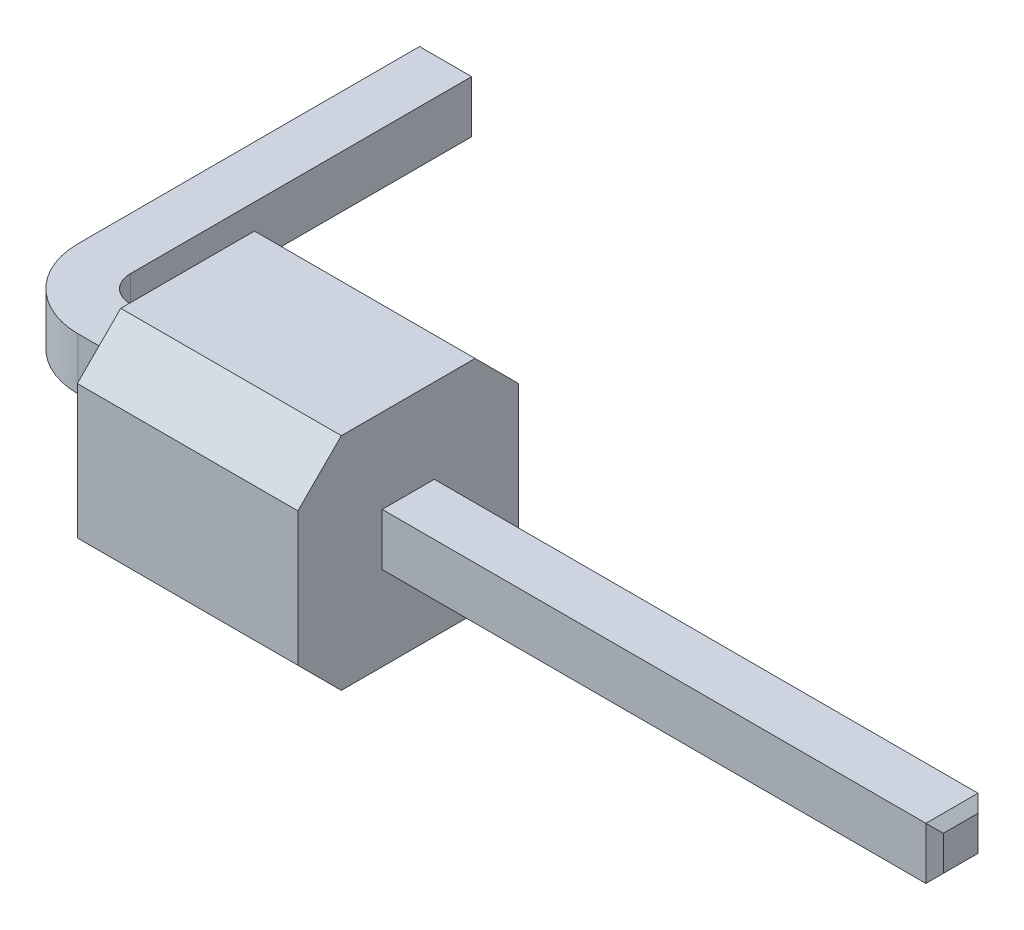
ISO-10303-21;
HEADER;
FILE_DESCRIPTION(('STEP AP214'),'2;1');
FILE_NAME('part.step','',(''),(''),'','','');
FILE_SCHEMA(('AUTOMOTIVE_DESIGN { 1 0 10303 214 1 1 1 1 }'));
ENDSEC;
DATA;
#1=APPLICATION_CONTEXT('core data for automotive mechanical design processes');
#2=APPLICATION_PROTOCOL_DEFINITION('international standard','automotive_design',2000,#1);
#3=PRODUCT_CONTEXT('',#1,'mechanical');
#4=PRODUCT('Part','Part','',(#3));
#5=PRODUCT_RELATED_PRODUCT_CATEGORY('part','',(#4));
#6=PRODUCT_DEFINITION_FORMATION('','',#4);
#7=PRODUCT_DEFINITION_CONTEXT('part definition',#1,'design');
#8=PRODUCT_DEFINITION('design','',#6,#7);
#9=PRODUCT_DEFINITION_SHAPE('','',#8);
#10=(LENGTH_UNIT() NAMED_UNIT(*) SI_UNIT(.MILLI.,.METRE.));
#11=(NAMED_UNIT(*) PLANE_ANGLE_UNIT() SI_UNIT($,.RADIAN.));
#12=(NAMED_UNIT(*) SI_UNIT($,.STERADIAN.) SOLID_ANGLE_UNIT());
#13=UNCERTAINTY_MEASURE_WITH_UNIT(LENGTH_MEASURE(1.E-05),#10,'distance_accuracy_value','');
#14=(GEOMETRIC_REPRESENTATION_CONTEXT(3) GLOBAL_UNCERTAINTY_ASSIGNED_CONTEXT((#13)) GLOBAL_UNIT_ASSIGNED_CONTEXT((#10,
#11,#12)) REPRESENTATION_CONTEXT('',''));
#15=CARTESIAN_POINT('',(0.,0.,0.));
#16=DIRECTION('',(0.,0.,1.));
#17=DIRECTION('',(1.,0.,0.));
#18=AXIS2_PLACEMENT_3D('',#15,#16,#17);
#19=CARTESIAN_POINT('',(2.54,1.27,2.04));
#20=DIRECTION('',(0.,-0.707106781186549,-0.707106781186546));
#21=DIRECTION('',(0.,0.707106781186546,-0.707106781186549));
#22=AXIS2_PLACEMENT_3D('',#19,#20,#21);
#23=PLANE('',#22);
#24=DIRECTION('',(0.,-0.707106781186546,0.707106781186549));
#25=VECTOR('',#24,1.);
#26=CARTESIAN_POINT('',(0.,1.27,2.04));
#27=LINE('',#26,#25);
#28=CARTESIAN_POINT('',(0.,1.27,2.04));
#29=VERTEX_POINT('',#28);
#30=CARTESIAN_POINT('',(0.,0.77,2.54));
#31=VERTEX_POINT('',#30);
#32=EDGE_CURVE('E263',#29,#31,#27,.T.);
#33=ORIENTED_EDGE('',*,*,#32,.T.);
#34=DIRECTION('',(-1.,0.,0.));
#35=VECTOR('',#34,1.);
#36=CARTESIAN_POINT('',(2.54,0.77,2.54));
#37=LINE('',#36,#35);
#38=CARTESIAN_POINT('',(2.54,0.77,2.54));
#39=VERTEX_POINT('',#38);
#40=EDGE_CURVE('E318',#39,#31,#37,.T.);
#41=ORIENTED_EDGE('',*,*,#40,.F.);
#42=DIRECTION('',(0.,-0.707106781186546,0.707106781186549));
#43=VECTOR('',#42,1.);
#44=CARTESIAN_POINT('',(2.54,1.27,2.04));
#45=LINE('',#44,#43);
#46=CARTESIAN_POINT('',(2.54,1.27,2.04));
#47=VERTEX_POINT('',#46);
#48=EDGE_CURVE('E264',#47,#39,#45,.T.);
#49=ORIENTED_EDGE('',*,*,#48,.F.);
#50=DIRECTION('',(-1.,0.,0.));
#51=VECTOR('',#50,1.);
#52=CARTESIAN_POINT('',(2.54,1.27,2.04));
#53=LINE('',#52,#51);
#54=EDGE_CURVE('E282',#47,#29,#53,.T.);
#55=ORIENTED_EDGE('',*,*,#54,.T.);
#56=EDGE_LOOP('',(#33,#41,#49,#55));
#57=FACE_BOUND('',#56,.T.);
#58=ADVANCED_FACE('F33',(#57),#23,.F.);
#59=CARTESIAN_POINT('',(2.54,0.77,2.54));
#60=DIRECTION('',(0.,0.,-1.));
#61=DIRECTION('',(-1.,0.,0.));
#62=AXIS2_PLACEMENT_3D('',#59,#60,#61);
#63=PLANE('',#62);
#64=DIRECTION('',(0.,-1.,0.));
#65=VECTOR('',#64,1.);
#66=CARTESIAN_POINT('',(0.,0.77,2.54));
#67=LINE('',#66,#65);
#68=CARTESIAN_POINT('',(0.,-0.77,2.54));
#69=VERTEX_POINT('',#68);
#70=EDGE_CURVE('E285',#31,#69,#67,.T.);
#71=ORIENTED_EDGE('',*,*,#70,.T.);
#72=DIRECTION('',(-1.,0.,0.));
#73=VECTOR('',#72,1.);
#74=CARTESIAN_POINT('',(2.54,-0.77,2.54));
#75=LINE('',#74,#73);
#76=CARTESIAN_POINT('',(2.54,-0.77,2.54));
#77=VERTEX_POINT('',#76);
#78=EDGE_CURVE('E315',#77,#69,#75,.T.);
#79=ORIENTED_EDGE('',*,*,#78,.F.);
#80=DIRECTION('',(0.,-1.,0.));
#81=VECTOR('',#80,1.);
#82=CARTESIAN_POINT('',(2.54,0.77,2.54));
#83=LINE('',#82,#81);
#84=EDGE_CURVE('E267',#39,#77,#83,.T.);
#85=ORIENTED_EDGE('',*,*,#84,.F.);
#86=ORIENTED_EDGE('',*,*,#40,.T.);
#87=EDGE_LOOP('',(#71,#79,#85,#86));
#88=FACE_BOUND('',#87,.T.);
#89=ADVANCED_FACE('F404',(#88),#63,.F.);
#90=CARTESIAN_POINT('',(2.54,-1.27,2.04));
#91=DIRECTION('',(0.,0.707106781186549,-0.707106781186546));
#92=DIRECTION('',(0.,0.707106781186546,0.707106781186549));
#93=AXIS2_PLACEMENT_3D('',#90,#91,#92);
#94=PLANE('',#93);
#95=DIRECTION('',(0.,-0.707106781186546,-0.707106781186549));
#96=VECTOR('',#95,1.);
#97=CARTESIAN_POINT('',(0.,-1.27,2.04));
#98=LINE('',#97,#96);
#99=CARTESIAN_POINT('',(0.,-1.27,2.04));
#100=VERTEX_POINT('',#99);
#101=EDGE_CURVE('E287',#69,#100,#98,.T.);
#102=ORIENTED_EDGE('',*,*,#101,.T.);
#103=DIRECTION('',(-1.,0.,0.));
#104=VECTOR('',#103,1.);
#105=CARTESIAN_POINT('',(2.54,-1.27,2.04));
#106=LINE('',#105,#104);
#107=CARTESIAN_POINT('',(2.54,-1.27,2.04));
#108=VERTEX_POINT('',#107);
#109=EDGE_CURVE('E312',#108,#100,#106,.T.);
#110=ORIENTED_EDGE('',*,*,#109,.F.);
#111=DIRECTION('',(0.,-0.707106781186546,-0.707106781186549));
#112=VECTOR('',#111,1.);
#113=CARTESIAN_POINT('',(2.54,-1.27,2.04));
#114=LINE('',#113,#112);
#115=EDGE_CURVE('E270',#77,#108,#114,.T.);
#116=ORIENTED_EDGE('',*,*,#115,.F.);
#117=ORIENTED_EDGE('',*,*,#78,.T.);
#118=EDGE_LOOP('',(#102,#110,#116,#117));
#119=FACE_BOUND('',#118,.T.);
#120=ADVANCED_FACE('F410',(#119),#94,.F.);
#121=CARTESIAN_POINT('',(2.54,-1.27,2.04));
#122=DIRECTION('',(0.,1.,0.));
#123=DIRECTION('',(0.,0.,1.));
#124=AXIS2_PLACEMENT_3D('',#121,#122,#123);
#125=PLANE('',#124);
#126=DIRECTION('',(0.,0.,-1.));
#127=VECTOR('',#126,1.);
#128=CARTESIAN_POINT('',(0.,-1.27,2.04));
#129=LINE('',#128,#127);
#130=CARTESIAN_POINT('',(0.,-1.27,0.500000000000002));
#131=VERTEX_POINT('',#130);
#132=EDGE_CURVE('E289',#100,#131,#129,.T.);
#133=ORIENTED_EDGE('',*,*,#132,.T.);
#134=DIRECTION('',(-1.,0.,0.));
#135=VECTOR('',#134,1.);
#136=CARTESIAN_POINT('',(2.54,-1.27,0.500000000000002));
#137=LINE('',#136,#135);
#138=CARTESIAN_POINT('',(2.54,-1.27,0.500000000000002));
#139=VERTEX_POINT('',#138);
#140=EDGE_CURVE('E309',#139,#131,#137,.T.);
#141=ORIENTED_EDGE('',*,*,#140,.F.);
#142=DIRECTION('',(0.,0.,-1.));
#143=VECTOR('',#142,1.);
#144=CARTESIAN_POINT('',(2.54,-1.27,2.04));
#145=LINE('',#144,#143);
#146=EDGE_CURVE('E272',#108,#139,#145,.T.);
#147=ORIENTED_EDGE('',*,*,#146,.F.);
#148=ORIENTED_EDGE('',*,*,#109,.T.);
#149=EDGE_LOOP('',(#133,#141,#147,#148));
#150=FACE_BOUND('',#149,.T.);
#151=ADVANCED_FACE('F533',(#150),#125,.F.);
#152=CARTESIAN_POINT('',(2.54,-1.27,0.500000000000002));
#153=DIRECTION('',(0.,0.707106781186549,0.707106781186546));
#154=DIRECTION('',(0.,-0.707106781186546,0.707106781186549));
#155=AXIS2_PLACEMENT_3D('',#152,#153,#154);
#156=PLANE('',#155);
#157=DIRECTION('',(0.,0.707106781186546,-0.707106781186549));
#158=VECTOR('',#157,1.);
#159=CARTESIAN_POINT('',(0.,-1.27,0.500000000000002));
#160=LINE('',#159,#158);
#161=CARTESIAN_POINT('',(0.,-0.77,0.));
#162=VERTEX_POINT('',#161);
#163=EDGE_CURVE('E291',#131,#162,#160,.T.);
#164=ORIENTED_EDGE('',*,*,#163,.T.);
#165=DIRECTION('',(-1.,0.,0.));
#166=VECTOR('',#165,1.);
#167=CARTESIAN_POINT('',(2.54,-0.77,0.));
#168=LINE('',#167,#166);
#169=CARTESIAN_POINT('',(2.54,-0.77,0.));
#170=VERTEX_POINT('',#169);
#171=EDGE_CURVE('E306',#170,#162,#168,.T.);
#172=ORIENTED_EDGE('',*,*,#171,.F.);
#173=DIRECTION('',(0.,0.707106781186546,-0.707106781186549));
#174=VECTOR('',#173,1.);
#175=CARTESIAN_POINT('',(2.54,-1.27,0.500000000000002));
#176=LINE('',#175,#174);
#177=EDGE_CURVE('E274',#139,#170,#176,.T.);
#178=ORIENTED_EDGE('',*,*,#177,.F.);
#179=ORIENTED_EDGE('',*,*,#140,.T.);
#180=EDGE_LOOP('',(#164,#172,#178,#179));
#181=FACE_BOUND('',#180,.T.);
#182=ADVANCED_FACE('F529',(#181),#156,.F.);
#183=CARTESIAN_POINT('',(2.54,0.77,0.));
#184=DIRECTION('',(0.,0.,1.));
#185=DIRECTION('',(1.,0.,0.));
#186=AXIS2_PLACEMENT_3D('',#183,#184,#185);
#187=PLANE('',#186);
#188=DIRECTION('',(0.,1.,0.));
#189=VECTOR('',#188,1.);
#190=CARTESIAN_POINT('',(0.,0.77,0.));
#191=LINE('',#190,#189);
#192=CARTESIAN_POINT('',(0.,0.77,0.));
#193=VERTEX_POINT('',#192);
#194=EDGE_CURVE('E293',#162,#193,#191,.T.);
#195=ORIENTED_EDGE('',*,*,#194,.T.);
#196=DIRECTION('',(-1.,0.,0.));
#197=VECTOR('',#196,1.);
#198=CARTESIAN_POINT('',(2.54,0.77,0.));
#199=LINE('',#198,#197);
#200=CARTESIAN_POINT('',(2.54,0.77,0.));
#201=VERTEX_POINT('',#200);
#202=EDGE_CURVE('E303',#201,#193,#199,.T.);
#203=ORIENTED_EDGE('',*,*,#202,.F.);
#204=DIRECTION('',(0.,1.,0.));
#205=VECTOR('',#204,1.);
#206=CARTESIAN_POINT('',(2.54,0.77,0.));
#207=LINE('',#206,#205);
#208=EDGE_CURVE('E276',#170,#201,#207,.T.);
#209=ORIENTED_EDGE('',*,*,#208,.F.);
#210=ORIENTED_EDGE('',*,*,#171,.T.);
#211=EDGE_LOOP('',(#195,#203,#209,#210));
#212=FACE_BOUND('',#211,.T.);
#213=ADVANCED_FACE('F525',(#212),#187,.F.);
#214=CARTESIAN_POINT('',(2.54,1.27,0.500000000000002));
#215=DIRECTION('',(0.,-0.707106781186549,0.707106781186546));
#216=DIRECTION('',(0.,-0.707106781186546,-0.707106781186549));
#217=AXIS2_PLACEMENT_3D('',#214,#215,#216);
#218=PLANE('',#217);
#219=DIRECTION('',(0.,0.707106781186546,0.707106781186549));
#220=VECTOR('',#219,1.);
#221=CARTESIAN_POINT('',(0.,1.27,0.500000000000002));
#222=LINE('',#221,#220);
#223=CARTESIAN_POINT('',(0.,1.27,0.500000000000002));
#224=VERTEX_POINT('',#223);
#225=EDGE_CURVE('E295',#193,#224,#222,.T.);
#226=ORIENTED_EDGE('',*,*,#225,.T.);
#227=DIRECTION('',(-1.,0.,0.));
#228=VECTOR('',#227,1.);
#229=CARTESIAN_POINT('',(2.54,1.27,0.500000000000002));
#230=LINE('',#229,#228);
#231=CARTESIAN_POINT('',(2.54,1.27,0.500000000000002));
#232=VERTEX_POINT('',#231);
#233=EDGE_CURVE('E300',#232,#224,#230,.T.);
#234=ORIENTED_EDGE('',*,*,#233,.F.);
#235=DIRECTION('',(0.,0.707106781186546,0.707106781186549));
#236=VECTOR('',#235,1.);
#237=CARTESIAN_POINT('',(2.54,1.27,0.500000000000002));
#238=LINE('',#237,#236);
#239=EDGE_CURVE('E278',#201,#232,#238,.T.);
#240=ORIENTED_EDGE('',*,*,#239,.F.);
#241=ORIENTED_EDGE('',*,*,#202,.T.);
#242=EDGE_LOOP('',(#226,#234,#240,#241));
#243=FACE_BOUND('',#242,.T.);
#244=ADVANCED_FACE('F521',(#243),#218,.F.);
#245=CARTESIAN_POINT('',(2.54,1.27,2.04));
#246=DIRECTION('',(0.,-1.,0.));
#247=DIRECTION('',(0.,0.,-1.));
#248=AXIS2_PLACEMENT_3D('',#245,#246,#247);
#249=PLANE('',#248);
#250=DIRECTION('',(0.,0.,1.));
#251=VECTOR('',#250,1.);
#252=CARTESIAN_POINT('',(0.,1.27,2.04));
#253=LINE('',#252,#251);
#254=EDGE_CURVE('E268',#224,#29,#253,.T.);
#255=ORIENTED_EDGE('',*,*,#254,.T.);
#256=ORIENTED_EDGE('',*,*,#54,.F.);
#257=DIRECTION('',(0.,0.,1.));
#258=VECTOR('',#257,1.);
#259=CARTESIAN_POINT('',(2.54,1.27,2.04));
#260=LINE('',#259,#258);
#261=EDGE_CURVE('E280',#232,#47,#260,.T.);
#262=ORIENTED_EDGE('',*,*,#261,.F.);
#263=ORIENTED_EDGE('',*,*,#233,.T.);
#264=EDGE_LOOP('',(#255,#256,#262,#263));
#265=FACE_BOUND('',#264,.T.);
#266=ADVANCED_FACE('F516',(#265),#249,.F.);
#267=CARTESIAN_POINT('',(2.54,0.,0.));
#268=DIRECTION('',(-1.,0.,0.));
#269=DIRECTION('',(0.,0.,1.));
#270=AXIS2_PLACEMENT_3D('',#267,#268,#269);
#271=PLANE('',#270);
#272=DIRECTION('',(0.,-1.,0.));
#273=VECTOR('',#272,1.);
#274=CARTESIAN_POINT('',(2.54,0.,1.57));
#275=LINE('',#274,#273);
#276=CARTESIAN_POINT('',(2.54,0.3,1.57));
#277=VERTEX_POINT('',#276);
#278=CARTESIAN_POINT('',(2.54,-0.3,1.57));
#279=VERTEX_POINT('',#278);
#280=EDGE_CURVE('E260',#277,#279,#275,.T.);
#281=ORIENTED_EDGE('',*,*,#280,.F.);
#282=DIRECTION('',(0.,0.,-1.));
#283=VECTOR('',#282,1.);
#284=CARTESIAN_POINT('',(2.54,0.3,0.));
#285=LINE('',#284,#283);
#286=CARTESIAN_POINT('',(2.54,0.3,0.97));
#287=VERTEX_POINT('',#286);
#288=EDGE_CURVE('E254',#277,#287,#285,.T.);
#289=ORIENTED_EDGE('',*,*,#288,.T.);
#290=DIRECTION('',(0.,1.,0.));
#291=VECTOR('',#290,1.);
#292=CARTESIAN_POINT('',(2.54,0.,0.97));
#293=LINE('',#292,#291);
#294=CARTESIAN_POINT('',(2.54,-0.3,0.97));
#295=VERTEX_POINT('',#294);
#296=EDGE_CURVE('E257',#295,#287,#293,.T.);
#297=ORIENTED_EDGE('',*,*,#296,.F.);
#298=DIRECTION('',(0.,0.,-1.));
#299=VECTOR('',#298,1.);
#300=CARTESIAN_POINT('',(2.54,-0.3,0.));
#301=LINE('',#300,#299);
#302=EDGE_CURVE('E212',#279,#295,#301,.T.);
#303=ORIENTED_EDGE('',*,*,#302,.F.);
#304=EDGE_LOOP('',(#281,#289,#297,#303));
#305=FACE_BOUND('',#304,.T.);
#306=ORIENTED_EDGE('',*,*,#48,.T.);
#307=ORIENTED_EDGE('',*,*,#84,.T.);
#308=ORIENTED_EDGE('',*,*,#115,.T.);
#309=ORIENTED_EDGE('',*,*,#146,.T.);
#310=ORIENTED_EDGE('',*,*,#177,.T.);
#311=ORIENTED_EDGE('',*,*,#208,.T.);
#312=ORIENTED_EDGE('',*,*,#239,.T.);
#313=ORIENTED_EDGE('',*,*,#261,.T.);
#314=EDGE_LOOP('',(#306,#307,#308,#309,#310,#311,#312,#313));
#315=FACE_BOUND('',#314,.T.);
#316=ADVANCED_FACE('F460',(#305,#315),#271,.F.);
#317=CARTESIAN_POINT('',(0.,0.,0.));
#318=DIRECTION('',(-1.,0.,0.));
#319=DIRECTION('',(0.,0.,1.));
#320=AXIS2_PLACEMENT_3D('',#317,#318,#319);
#321=PLANE('',#320);
#322=DIRECTION('',(0.,0.,-1.));
#323=VECTOR('',#322,1.);
#324=CARTESIAN_POINT('',(0.,0.3,0.));
#325=LINE('',#324,#323);
#326=CARTESIAN_POINT('',(0.,0.3,1.57));
#327=VERTEX_POINT('',#326);
#328=CARTESIAN_POINT('',(0.,0.3,0.97));
#329=VERTEX_POINT('',#328);
#330=EDGE_CURVE('E330',#327,#329,#325,.T.);
#331=ORIENTED_EDGE('',*,*,#330,.F.);
#332=DIRECTION('',(0.,-1.,0.));
#333=VECTOR('',#332,1.);
#334=CARTESIAN_POINT('',(0.,0.,1.57));
#335=LINE('',#334,#333);
#336=CARTESIAN_POINT('',(0.,-0.3,1.57));
#337=VERTEX_POINT('',#336);
#338=EDGE_CURVE('E327',#327,#337,#335,.T.);
#339=ORIENTED_EDGE('',*,*,#338,.T.);
#340=DIRECTION('',(0.,0.,-1.));
#341=VECTOR('',#340,1.);
#342=CARTESIAN_POINT('',(0.,-0.3,0.));
#343=LINE('',#342,#341);
#344=CARTESIAN_POINT('',(0.,-0.3,0.97));
#345=VERTEX_POINT('',#344);
#346=EDGE_CURVE('E321',#337,#345,#343,.T.);
#347=ORIENTED_EDGE('',*,*,#346,.T.);
#348=DIRECTION('',(0.,1.,0.));
#349=VECTOR('',#348,1.);
#350=CARTESIAN_POINT('',(0.,0.,0.97));
#351=LINE('',#350,#349);
#352=EDGE_CURVE('E324',#345,#329,#351,.T.);
#353=ORIENTED_EDGE('',*,*,#352,.T.);
#354=EDGE_LOOP('',(#331,#339,#347,#353));
#355=FACE_BOUND('',#354,.T.);
#356=ORIENTED_EDGE('',*,*,#32,.F.);
#357=ORIENTED_EDGE('',*,*,#254,.F.);
#358=ORIENTED_EDGE('',*,*,#225,.F.);
#359=ORIENTED_EDGE('',*,*,#194,.F.);
#360=ORIENTED_EDGE('',*,*,#163,.F.);
#361=ORIENTED_EDGE('',*,*,#132,.F.);
#362=ORIENTED_EDGE('',*,*,#101,.F.);
#363=ORIENTED_EDGE('',*,*,#70,.F.);
#364=EDGE_LOOP('',(#356,#357,#358,#359,#360,#361,#362,#363));
#365=FACE_BOUND('',#364,.T.);
#366=ADVANCED_FACE('F488',(#355,#365),#321,.T.);
#367=CARTESIAN_POINT('',(-0.96,0.3,0.67));
#368=DIRECTION('',(0.,-1.,0.));
#369=DIRECTION('',(0.,0.,-1.));
#370=AXIS2_PLACEMENT_3D('',#367,#368,#369);
#371=CYLINDRICAL_SURFACE('',#370,0.3);
#372=CARTESIAN_POINT('',(-0.96,-0.3,0.67));
#373=DIRECTION('',(0.,-1.,0.));
#374=DIRECTION('',(0.,0.,1.));
#375=AXIS2_PLACEMENT_3D('',#372,#373,#374);
#376=CIRCLE('',#375,0.3);
#377=CARTESIAN_POINT('',(-0.96,-0.3,0.97));
#378=VERTEX_POINT('',#377);
#379=CARTESIAN_POINT('',(-1.26,-0.3,0.67));
#380=VERTEX_POINT('',#379);
#381=EDGE_CURVE('E243',#378,#380,#376,.T.);
#382=ORIENTED_EDGE('',*,*,#381,.T.);
#383=DIRECTION('',(0.,-1.,0.));
#384=VECTOR('',#383,1.);
#385=CARTESIAN_POINT('',(-1.26,0.3,0.67));
#386=LINE('',#385,#384);
#387=CARTESIAN_POINT('',(-1.26,0.3,0.67));
#388=VERTEX_POINT('',#387);
#389=EDGE_CURVE('E231',#388,#380,#386,.T.);
#390=ORIENTED_EDGE('',*,*,#389,.F.);
#391=CARTESIAN_POINT('',(-0.96,0.3,0.67));
#392=DIRECTION('',(0.,-1.,0.));
#393=DIRECTION('',(0.,0.,1.));
#394=AXIS2_PLACEMENT_3D('',#391,#392,#393);
#395=CIRCLE('',#394,0.3);
#396=CARTESIAN_POINT('',(-0.96,0.3,0.97));
#397=VERTEX_POINT('',#396);
#398=EDGE_CURVE('E227',#397,#388,#395,.T.);
#399=ORIENTED_EDGE('',*,*,#398,.F.);
#400=DIRECTION('',(0.,-1.,0.));
#401=VECTOR('',#400,1.);
#402=CARTESIAN_POINT('',(-0.96,0.3,0.97));
#403=LINE('',#402,#401);
#404=EDGE_CURVE('E248',#397,#378,#403,.T.);
#405=ORIENTED_EDGE('',*,*,#404,.T.);
#406=EDGE_LOOP('',(#382,#390,#399,#405));
#407=FACE_BOUND('',#406,.T.);
#408=ADVANCED_FACE('F496',(#407),#371,.F.);
#409=CARTESIAN_POINT('',(-1.26,0.3,-3.36));
#410=DIRECTION('',(-1.,0.,0.));
#411=DIRECTION('',(0.,0.,1.));
#412=AXIS2_PLACEMENT_3D('',#409,#410,#411);
#413=PLANE('',#412);
#414=DIRECTION('',(0.,0.,-1.));
#415=VECTOR('',#414,1.);
#416=CARTESIAN_POINT('',(-1.26,-0.3,-3.36));
#417=LINE('',#416,#415);
#418=CARTESIAN_POINT('',(-1.26,-0.3,-3.26));
#419=VERTEX_POINT('',#418);
#420=EDGE_CURVE('E204',#380,#419,#417,.T.);
#421=ORIENTED_EDGE('',*,*,#420,.T.);
#422=DIRECTION('',(0.,1.,0.));
#423=VECTOR('',#422,1.);
#424=CARTESIAN_POINT('',(-1.26,0.3,-3.26));
#425=LINE('',#424,#423);
#426=CARTESIAN_POINT('',(-1.26,0.3,-3.26));
#427=VERTEX_POINT('',#426);
#428=EDGE_CURVE('E360',#419,#427,#425,.T.);
#429=ORIENTED_EDGE('',*,*,#428,.T.);
#430=DIRECTION('',(0.,0.,-1.));
#431=VECTOR('',#430,1.);
#432=CARTESIAN_POINT('',(-1.26,0.3,-3.36));
#433=LINE('',#432,#431);
#434=EDGE_CURVE('E229',#388,#427,#433,.T.);
#435=ORIENTED_EDGE('',*,*,#434,.F.);
#436=ORIENTED_EDGE('',*,*,#389,.T.);
#437=EDGE_LOOP('',(#421,#429,#435,#436));
#438=FACE_BOUND('',#437,.T.);
#439=ADVANCED_FACE('F499',(#438),#413,.F.);
#440=CARTESIAN_POINT('',(-1.86,0.3,-3.36));
#441=DIRECTION('',(0.,0.,1.));
#442=DIRECTION('',(1.,0.,0.));
#443=AXIS2_PLACEMENT_3D('',#440,#441,#442);
#444=PLANE('',#443);
#445=DIRECTION('',(0.,1.,0.));
#446=VECTOR('',#445,1.);
#447=CARTESIAN_POINT('',(-1.76,0.3,-3.36));
#448=LINE('',#447,#446);
#449=CARTESIAN_POINT('',(-1.76,-0.200000000000001,-3.36));
#450=VERTEX_POINT('',#449);
#451=CARTESIAN_POINT('',(-1.76,0.200000000000001,-3.36));
#452=VERTEX_POINT('',#451);
#453=EDGE_CURVE('E353',#450,#452,#448,.T.);
#454=ORIENTED_EDGE('',*,*,#453,.T.);
#455=DIRECTION('',(1.,0.,0.));
#456=VECTOR('',#455,1.);
#457=CARTESIAN_POINT('',(-1.26,0.200000000000001,-3.36));
#458=LINE('',#457,#456);
#459=CARTESIAN_POINT('',(-1.36,0.200000000000001,-3.36));
#460=VERTEX_POINT('',#459);
#461=EDGE_CURVE('E357',#452,#460,#458,.T.);
#462=ORIENTED_EDGE('',*,*,#461,.T.);
#463=DIRECTION('',(0.,-1.,0.));
#464=VECTOR('',#463,1.);
#465=CARTESIAN_POINT('',(-1.36,0.3,-3.36));
#466=LINE('',#465,#464);
#467=CARTESIAN_POINT('',(-1.36,-0.200000000000001,-3.36));
#468=VERTEX_POINT('',#467);
#469=EDGE_CURVE('E355',#460,#468,#466,.T.);
#470=ORIENTED_EDGE('',*,*,#469,.T.);
#471=DIRECTION('',(-1.,0.,0.));
#472=VECTOR('',#471,1.);
#473=CARTESIAN_POINT('',(-1.86,-0.200000000000001,-3.36));
#474=LINE('',#473,#472);
#475=EDGE_CURVE('E351',#468,#450,#474,.T.);
#476=ORIENTED_EDGE('',*,*,#475,.T.);
#477=EDGE_LOOP('',(#454,#462,#470,#476));
#478=FACE_BOUND('',#477,.T.);
#479=ADVANCED_FACE('F390',(#478),#444,.F.);
#480=CARTESIAN_POINT('',(-1.86,0.3,-3.36));
#481=DIRECTION('',(1.,0.,0.));
#482=DIRECTION('',(0.,0.,-1.));
#483=AXIS2_PLACEMENT_3D('',#480,#481,#482);
#484=PLANE('',#483);
#485=DIRECTION('',(0.,0.,1.));
#486=VECTOR('',#485,1.);
#487=CARTESIAN_POINT('',(-1.86,0.3,-3.36));
#488=LINE('',#487,#486);
#489=CARTESIAN_POINT('',(-1.86,0.3,-3.26));
#490=VERTEX_POINT('',#489);
#491=CARTESIAN_POINT('',(-1.86,0.3,0.67));
#492=VERTEX_POINT('',#491);
#493=EDGE_CURVE('E194',#490,#492,#488,.T.);
#494=ORIENTED_EDGE('',*,*,#493,.F.);
#495=DIRECTION('',(0.,-1.,0.));
#496=VECTOR('',#495,1.);
#497=CARTESIAN_POINT('',(-1.86,0.3,-3.26));
#498=LINE('',#497,#496);
#499=CARTESIAN_POINT('',(-1.86,-0.3,-3.26));
#500=VERTEX_POINT('',#499);
#501=EDGE_CURVE('E42',#490,#500,#498,.T.);
#502=ORIENTED_EDGE('',*,*,#501,.T.);
#503=DIRECTION('',(0.,0.,1.));
#504=VECTOR('',#503,1.);
#505=CARTESIAN_POINT('',(-1.86,-0.3,-3.36));
#506=LINE('',#505,#504);
#507=CARTESIAN_POINT('',(-1.86,-0.3,0.67));
#508=VERTEX_POINT('',#507);
#509=EDGE_CURVE('E209',#500,#508,#506,.T.);
#510=ORIENTED_EDGE('',*,*,#509,.T.);
#511=DIRECTION('',(0.,-1.,0.));
#512=VECTOR('',#511,1.);
#513=CARTESIAN_POINT('',(-1.86,0.3,0.67));
#514=LINE('',#513,#512);
#515=EDGE_CURVE('E207',#492,#508,#514,.T.);
#516=ORIENTED_EDGE('',*,*,#515,.F.);
#517=EDGE_LOOP('',(#494,#502,#510,#516));
#518=FACE_BOUND('',#517,.T.);
#519=ADVANCED_FACE('F208',(#518),#484,.F.);
#520=CARTESIAN_POINT('',(-0.96,0.3,0.67));
#521=DIRECTION('',(0.,-1.,0.));
#522=DIRECTION('',(0.,0.,-1.));
#523=AXIS2_PLACEMENT_3D('',#520,#521,#522);
#524=CYLINDRICAL_SURFACE('',#523,0.9);
#525=CARTESIAN_POINT('',(-0.96,-0.3,0.67));
#526=DIRECTION('',(0.,1.,0.));
#527=DIRECTION('',(0.,0.,1.));
#528=AXIS2_PLACEMENT_3D('',#525,#526,#527);
#529=CIRCLE('',#528,0.9);
#530=CARTESIAN_POINT('',(-0.96,-0.3,1.57));
#531=VERTEX_POINT('',#530);
#532=EDGE_CURVE('E233',#508,#531,#529,.T.);
#533=ORIENTED_EDGE('',*,*,#532,.T.);
#534=DIRECTION('',(0.,-1.,0.));
#535=VECTOR('',#534,1.);
#536=CARTESIAN_POINT('',(-0.96,0.3,1.57));
#537=LINE('',#536,#535);
#538=CARTESIAN_POINT('',(-0.96,0.3,1.57));
#539=VERTEX_POINT('',#538);
#540=EDGE_CURVE('E213',#539,#531,#537,.T.);
#541=ORIENTED_EDGE('',*,*,#540,.F.);
#542=CARTESIAN_POINT('',(-0.96,0.3,0.67));
#543=DIRECTION('',(0.,1.,0.));
#544=DIRECTION('',(0.,0.,1.));
#545=AXIS2_PLACEMENT_3D('',#542,#543,#544);
#546=CIRCLE('',#545,0.9);
#547=EDGE_CURVE('E200',#492,#539,#546,.T.);
#548=ORIENTED_EDGE('',*,*,#547,.F.);
#549=ORIENTED_EDGE('',*,*,#515,.T.);
#550=EDGE_LOOP('',(#533,#541,#548,#549));
#551=FACE_BOUND('',#550,.T.);
#552=ADVANCED_FACE('F215',(#551),#524,.T.);
#553=CARTESIAN_POINT('',(-0.96,0.3,0.67));
#554=DIRECTION('',(0.,1.,0.));
#555=DIRECTION('',(0.,0.,1.));
#556=AXIS2_PLACEMENT_3D('',#553,#554,#555);
#557=PLANE('',#556);
#558=ORIENTED_EDGE('',*,*,#434,.T.);
#559=DIRECTION('',(-1.,0.,0.));
#560=VECTOR('',#559,1.);
#561=CARTESIAN_POINT('',(-1.86,0.3,-3.26));
#562=LINE('',#561,#560);
#563=EDGE_CURVE('E203',#427,#490,#562,.T.);
#564=ORIENTED_EDGE('',*,*,#563,.T.);
#565=ORIENTED_EDGE('',*,*,#493,.T.);
#566=ORIENTED_EDGE('',*,*,#547,.T.);
#567=DIRECTION('',(1.,0.,0.));
#568=VECTOR('',#567,1.);
#569=CARTESIAN_POINT('',(-0.96,0.3,1.57));
#570=LINE('',#569,#568);
#571=EDGE_CURVE('E221',#539,#327,#570,.T.);
#572=ORIENTED_EDGE('',*,*,#571,.T.);
#573=ORIENTED_EDGE('',*,*,#330,.T.);
#574=DIRECTION('',(-1.,0.,0.));
#575=VECTOR('',#574,1.);
#576=CARTESIAN_POINT('',(-0.96,0.3,0.97));
#577=LINE('',#576,#575);
#578=EDGE_CURVE('E224',#329,#397,#577,.T.);
#579=ORIENTED_EDGE('',*,*,#578,.T.);
#580=ORIENTED_EDGE('',*,*,#398,.T.);
#581=EDGE_LOOP('',(#558,#564,#565,#566,#572,#573,#579,#580));
#582=FACE_BOUND('',#581,.T.);
#583=ADVANCED_FACE('F197',(#582),#557,.T.);
#584=CARTESIAN_POINT('',(-0.96,-0.3,0.67));
#585=DIRECTION('',(0.,1.,0.));
#586=DIRECTION('',(0.,0.,1.));
#587=AXIS2_PLACEMENT_3D('',#584,#585,#586);
#588=PLANE('',#587);
#589=ORIENTED_EDGE('',*,*,#509,.F.);
#590=DIRECTION('',(1.,0.,0.));
#591=VECTOR('',#590,1.);
#592=CARTESIAN_POINT('',(-0.96,-0.3,-3.26));
#593=LINE('',#592,#591);
#594=EDGE_CURVE('E11',#500,#419,#593,.T.);
#595=ORIENTED_EDGE('',*,*,#594,.T.);
#596=ORIENTED_EDGE('',*,*,#420,.F.);
#597=ORIENTED_EDGE('',*,*,#381,.F.);
#598=DIRECTION('',(-1.,0.,0.));
#599=VECTOR('',#598,1.);
#600=CARTESIAN_POINT('',(-0.96,-0.3,0.97));
#601=LINE('',#600,#599);
#602=EDGE_CURVE('E240',#345,#378,#601,.T.);
#603=ORIENTED_EDGE('',*,*,#602,.F.);
#604=ORIENTED_EDGE('',*,*,#346,.F.);
#605=DIRECTION('',(1.,0.,0.));
#606=VECTOR('',#605,1.);
#607=CARTESIAN_POINT('',(-0.96,-0.3,1.57));
#608=LINE('',#607,#606);
#609=EDGE_CURVE('E237',#531,#337,#608,.T.);
#610=ORIENTED_EDGE('',*,*,#609,.F.);
#611=ORIENTED_EDGE('',*,*,#532,.F.);
#612=EDGE_LOOP('',(#589,#595,#596,#597,#603,#604,#610,#611));
#613=FACE_BOUND('',#612,.T.);
#614=ADVANCED_FACE('F468',(#613),#588,.F.);
#615=CARTESIAN_POINT('',(-0.96,0.3,0.97));
#616=DIRECTION('',(0.,0.,1.));
#617=DIRECTION('',(1.,0.,0.));
#618=AXIS2_PLACEMENT_3D('',#615,#616,#617);
#619=PLANE('',#618);
#620=ORIENTED_EDGE('',*,*,#352,.F.);
#621=ORIENTED_EDGE('',*,*,#602,.T.);
#622=ORIENTED_EDGE('',*,*,#404,.F.);
#623=ORIENTED_EDGE('',*,*,#578,.F.);
#624=EDGE_LOOP('',(#620,#621,#622,#623));
#625=FACE_BOUND('',#624,.T.);
#626=ADVANCED_FACE('F475',(#625),#619,.F.);
#627=CARTESIAN_POINT('',(-0.96,0.3,1.57));
#628=DIRECTION('',(0.,0.,-1.));
#629=DIRECTION('',(-1.,0.,0.));
#630=AXIS2_PLACEMENT_3D('',#627,#628,#629);
#631=PLANE('',#630);
#632=ORIENTED_EDGE('',*,*,#338,.F.);
#633=ORIENTED_EDGE('',*,*,#571,.F.);
#634=ORIENTED_EDGE('',*,*,#540,.T.);
#635=ORIENTED_EDGE('',*,*,#609,.T.);
#636=EDGE_LOOP('',(#632,#633,#634,#635));
#637=FACE_BOUND('',#636,.T.);
#638=ADVANCED_FACE('F480',(#637),#631,.F.);
#639=CARTESIAN_POINT('',(8.8,-0.3,1.57));
#640=VERTEX_POINT('',#639);
#641=EDGE_CURVE('E236',#279,#640,#608,.T.);
#642=ORIENTED_EDGE('',*,*,#641,.T.);
#643=DIRECTION('',(0.,1.,0.));
#644=VECTOR('',#643,1.);
#645=CARTESIAN_POINT('',(8.8,0.3,1.57));
#646=LINE('',#645,#644);
#647=CARTESIAN_POINT('',(8.8,0.3,1.57));
#648=VERTEX_POINT('',#647);
#649=EDGE_CURVE('E344',#640,#648,#646,.T.);
#650=ORIENTED_EDGE('',*,*,#649,.T.);
#651=EDGE_CURVE('E218',#277,#648,#570,.T.);
#652=ORIENTED_EDGE('',*,*,#651,.F.);
#653=ORIENTED_EDGE('',*,*,#280,.T.);
#654=EDGE_LOOP('',(#642,#650,#652,#653));
#655=FACE_BOUND('',#654,.T.);
#656=ADVANCED_FACE('F452',(#655),#631,.F.);
#657=CARTESIAN_POINT('',(8.8,0.3,0.97));
#658=VERTEX_POINT('',#657);
#659=EDGE_CURVE('E225',#658,#287,#577,.T.);
#660=ORIENTED_EDGE('',*,*,#659,.F.);
#661=DIRECTION('',(0.,-1.,0.));
#662=VECTOR('',#661,1.);
#663=CARTESIAN_POINT('',(8.8,0.3,0.97));
#664=LINE('',#663,#662);
#665=CARTESIAN_POINT('',(8.8,-0.3,0.97));
#666=VERTEX_POINT('',#665);
#667=EDGE_CURVE('E348',#658,#666,#664,.T.);
#668=ORIENTED_EDGE('',*,*,#667,.T.);
#669=EDGE_CURVE('E241',#666,#295,#601,.T.);
#670=ORIENTED_EDGE('',*,*,#669,.T.);
#671=ORIENTED_EDGE('',*,*,#296,.T.);
#672=EDGE_LOOP('',(#660,#668,#670,#671));
#673=FACE_BOUND('',#672,.T.);
#674=ADVANCED_FACE('F463',(#673),#619,.F.);
#675=ORIENTED_EDGE('',*,*,#651,.T.);
#676=DIRECTION('',(0.,0.,-1.));
#677=VECTOR('',#676,1.);
#678=CARTESIAN_POINT('',(8.8,0.3,0.97));
#679=LINE('',#678,#677);
#680=EDGE_CURVE('E332',#648,#658,#679,.T.);
#681=ORIENTED_EDGE('',*,*,#680,.T.);
#682=ORIENTED_EDGE('',*,*,#659,.T.);
#683=ORIENTED_EDGE('',*,*,#288,.F.);
#684=EDGE_LOOP('',(#675,#681,#682,#683));
#685=FACE_BOUND('',#684,.T.);
#686=ADVANCED_FACE('F456',(#685),#557,.T.);
#687=ORIENTED_EDGE('',*,*,#669,.F.);
#688=DIRECTION('',(0.,0.,1.));
#689=VECTOR('',#688,1.);
#690=CARTESIAN_POINT('',(8.8,-0.3,0.67));
#691=LINE('',#690,#689);
#692=EDGE_CURVE('E346',#666,#640,#691,.T.);
#693=ORIENTED_EDGE('',*,*,#692,.T.);
#694=ORIENTED_EDGE('',*,*,#641,.F.);
#695=ORIENTED_EDGE('',*,*,#302,.T.);
#696=EDGE_LOOP('',(#687,#693,#694,#695));
#697=FACE_BOUND('',#696,.T.);
#698=ADVANCED_FACE('F434',(#697),#588,.F.);
#699=CARTESIAN_POINT('',(8.9,0.3,1.57));
#700=DIRECTION('',(-1.,0.,0.));
#701=DIRECTION('',(0.,0.,1.));
#702=AXIS2_PLACEMENT_3D('',#699,#700,#701);
#703=PLANE('',#702);
#704=DIRECTION('',(0.,1.,0.));
#705=VECTOR('',#704,1.);
#706=CARTESIAN_POINT('',(8.9,0.3,1.07));
#707=LINE('',#706,#705);
#708=CARTESIAN_POINT('',(8.9,-0.199999999999999,1.07));
#709=VERTEX_POINT('',#708);
#710=CARTESIAN_POINT('',(8.9,0.199999999999999,1.07));
#711=VERTEX_POINT('',#710);
#712=EDGE_CURVE('E335',#709,#711,#707,.T.);
#713=ORIENTED_EDGE('',*,*,#712,.T.);
#714=DIRECTION('',(0.,0.,1.));
#715=VECTOR('',#714,1.);
#716=CARTESIAN_POINT('',(8.9,0.199999999999999,1.57));
#717=LINE('',#716,#715);
#718=CARTESIAN_POINT('',(8.9,0.199999999999999,1.47));
#719=VERTEX_POINT('',#718);
#720=EDGE_CURVE('E341',#711,#719,#717,.T.);
#721=ORIENTED_EDGE('',*,*,#720,.T.);
#722=DIRECTION('',(0.,-1.,0.));
#723=VECTOR('',#722,1.);
#724=CARTESIAN_POINT('',(8.9,0.3,1.47));
#725=LINE('',#724,#723);
#726=CARTESIAN_POINT('',(8.9,-0.199999999999999,1.47));
#727=VERTEX_POINT('',#726);
#728=EDGE_CURVE('E339',#719,#727,#725,.T.);
#729=ORIENTED_EDGE('',*,*,#728,.T.);
#730=DIRECTION('',(0.,0.,-1.));
#731=VECTOR('',#730,1.);
#732=CARTESIAN_POINT('',(8.9,-0.199999999999999,1.57));
#733=LINE('',#732,#731);
#734=EDGE_CURVE('E337',#727,#709,#733,.T.);
#735=ORIENTED_EDGE('',*,*,#734,.T.);
#736=EDGE_LOOP('',(#713,#721,#729,#735));
#737=FACE_BOUND('',#736,.T.);
#738=ADVANCED_FACE('F429',(#737),#703,.F.);
#739=CARTESIAN_POINT('',(8.9,-0.199999999999999,1.57));
#740=DIRECTION('',(-0.707106781186547,0.707106781186547,0.));
#741=DIRECTION('',(0.,0.,-1.));
#742=AXIS2_PLACEMENT_3D('',#739,#740,#741);
#743=PLANE('',#742);
#744=DIRECTION('',(-0.577350269189626,-0.577350269189626,-0.577350269189626));
#745=VECTOR('',#744,1.);
#746=CARTESIAN_POINT('',(9.,-0.1,1.17));
#747=LINE('',#746,#745);
#748=EDGE_CURVE('E367',#709,#666,#747,.T.);
#749=ORIENTED_EDGE('',*,*,#748,.F.);
#750=ORIENTED_EDGE('',*,*,#734,.F.);
#751=DIRECTION('',(-0.577350269189626,-0.577350269189626,0.577350269189626));
#752=VECTOR('',#751,1.);
#753=CARTESIAN_POINT('',(8.86666666666667,-0.233333333333333,1.50333333333333));
#754=LINE('',#753,#752);
#755=EDGE_CURVE('E234',#640,#727,#754,.F.);
#756=ORIENTED_EDGE('',*,*,#755,.F.);
#757=ORIENTED_EDGE('',*,*,#692,.F.);
#758=EDGE_LOOP('',(#749,#750,#756,#757));
#759=FACE_BOUND('',#758,.T.);
#760=ADVANCED_FACE('F426',(#759),#743,.F.);
#761=CARTESIAN_POINT('',(8.9,0.3,1.47));
#762=DIRECTION('',(-0.707106781186547,0.,-0.707106781186547));
#763=DIRECTION('',(0.,-1.,0.));
#764=AXIS2_PLACEMENT_3D('',#761,#762,#763);
#765=PLANE('',#764);
#766=ORIENTED_EDGE('',*,*,#755,.T.);
#767=ORIENTED_EDGE('',*,*,#728,.F.);
#768=DIRECTION('',(0.577350269189626,-0.577350269189626,-0.577350269189626));
#769=VECTOR('',#768,1.);
#770=CARTESIAN_POINT('',(8.86666666666667,0.233333333333333,1.50333333333333));
#771=LINE('',#770,#769);
#772=EDGE_CURVE('E365',#648,#719,#771,.T.);
#773=ORIENTED_EDGE('',*,*,#772,.F.);
#774=ORIENTED_EDGE('',*,*,#649,.F.);
#775=EDGE_LOOP('',(#766,#767,#773,#774));
#776=FACE_BOUND('',#775,.T.);
#777=ADVANCED_FACE('F422',(#776),#765,.F.);
#778=CARTESIAN_POINT('',(8.8,0.3,0.97));
#779=DIRECTION('',(-0.707106781186547,0.,0.707106781186547));
#780=DIRECTION('',(0.,-1.,0.));
#781=AXIS2_PLACEMENT_3D('',#778,#779,#780);
#782=PLANE('',#781);
#783=ORIENTED_EDGE('',*,*,#748,.T.);
#784=ORIENTED_EDGE('',*,*,#667,.F.);
#785=DIRECTION('',(-0.577350269189626,0.577350269189626,-0.577350269189626));
#786=VECTOR('',#785,1.);
#787=CARTESIAN_POINT('',(8.8,0.3,0.97));
#788=LINE('',#787,#786);
#789=EDGE_CURVE('E363',#711,#658,#788,.T.);
#790=ORIENTED_EDGE('',*,*,#789,.F.);
#791=ORIENTED_EDGE('',*,*,#712,.F.);
#792=EDGE_LOOP('',(#783,#784,#790,#791));
#793=FACE_BOUND('',#792,.T.);
#794=ADVANCED_FACE('F418',(#793),#782,.F.);
#795=CARTESIAN_POINT('',(8.8,0.3,0.67));
#796=DIRECTION('',(0.707106781186547,0.707106781186547,0.));
#797=DIRECTION('',(0.,0.,1.));
#798=AXIS2_PLACEMENT_3D('',#795,#796,#797);
#799=PLANE('',#798);
#800=ORIENTED_EDGE('',*,*,#772,.T.);
#801=ORIENTED_EDGE('',*,*,#720,.F.);
#802=ORIENTED_EDGE('',*,*,#789,.T.);
#803=ORIENTED_EDGE('',*,*,#680,.F.);
#804=EDGE_LOOP('',(#800,#801,#802,#803));
#805=FACE_BOUND('',#804,.T.);
#806=ADVANCED_FACE('F415',(#805),#799,.T.);
#807=CARTESIAN_POINT('',(-1.86,-0.200000000000001,-3.36));
#808=DIRECTION('',(0.,0.707106781186548,0.707106781186548));
#809=DIRECTION('',(-1.,0.,0.));
#810=AXIS2_PLACEMENT_3D('',#807,#808,#809);
#811=PLANE('',#810);
#812=DIRECTION('',(0.577350269189626,0.577350269189626,-0.577350269189626));
#813=VECTOR('',#812,1.);
#814=CARTESIAN_POINT('',(-1.79333333333333,-0.233333333333334,-3.32666666666667));
#815=LINE('',#814,#813);
#816=EDGE_CURVE('E375',#450,#500,#815,.F.);
#817=ORIENTED_EDGE('',*,*,#816,.F.);
#818=ORIENTED_EDGE('',*,*,#475,.F.);
#819=DIRECTION('',(0.577350269189626,-0.577350269189626,0.577350269189626));
#820=VECTOR('',#819,1.);
#821=CARTESIAN_POINT('',(-1.52666666666667,-0.0333333333333338,-3.52666666666667));
#822=LINE('',#821,#820);
#823=EDGE_CURVE('E37',#419,#468,#822,.F.);
#824=ORIENTED_EDGE('',*,*,#823,.F.);
#825=ORIENTED_EDGE('',*,*,#594,.F.);
#826=EDGE_LOOP('',(#817,#818,#824,#825));
#827=FACE_BOUND('',#826,.T.);
#828=ADVANCED_FACE('F35',(#827),#811,.F.);
#829=CARTESIAN_POINT('',(-1.36,0.3,-3.36));
#830=DIRECTION('',(-0.707106781186548,0.,0.707106781186548));
#831=DIRECTION('',(0.,-1.,0.));
#832=AXIS2_PLACEMENT_3D('',#829,#830,#831);
#833=PLANE('',#832);
#834=ORIENTED_EDGE('',*,*,#823,.T.);
#835=ORIENTED_EDGE('',*,*,#469,.F.);
#836=DIRECTION('',(-0.577350269189626,-0.577350269189626,-0.577350269189626));
#837=VECTOR('',#836,1.);
#838=CARTESIAN_POINT('',(-1.32666666666667,0.233333333333334,-3.32666666666667));
#839=LINE('',#838,#837);
#840=EDGE_CURVE('E374',#427,#460,#839,.T.);
#841=ORIENTED_EDGE('',*,*,#840,.F.);
#842=ORIENTED_EDGE('',*,*,#428,.F.);
#843=EDGE_LOOP('',(#834,#835,#841,#842));
#844=FACE_BOUND('',#843,.T.);
#845=ADVANCED_FACE('F385',(#844),#833,.F.);
#846=CARTESIAN_POINT('',(-1.86,0.3,-3.26));
#847=DIRECTION('',(0.707106781186548,0.,0.707106781186548));
#848=DIRECTION('',(0.,-1.,0.));
#849=AXIS2_PLACEMENT_3D('',#846,#847,#848);
#850=PLANE('',#849);
#851=ORIENTED_EDGE('',*,*,#816,.T.);
#852=ORIENTED_EDGE('',*,*,#501,.F.);
#853=DIRECTION('',(-0.577350269189626,0.577350269189626,0.577350269189626));
#854=VECTOR('',#853,1.);
#855=CARTESIAN_POINT('',(-1.86,0.3,-3.26));
#856=LINE('',#855,#854);
#857=EDGE_CURVE('E372',#452,#490,#856,.T.);
#858=ORIENTED_EDGE('',*,*,#857,.F.);
#859=ORIENTED_EDGE('',*,*,#453,.F.);
#860=EDGE_LOOP('',(#851,#852,#858,#859));
#861=FACE_BOUND('',#860,.T.);
#862=ADVANCED_FACE('F395',(#861),#850,.F.);
#863=CARTESIAN_POINT('',(-0.96,0.3,-3.26));
#864=DIRECTION('',(0.,0.707106781186548,-0.707106781186548));
#865=DIRECTION('',(1.,0.,0.));
#866=AXIS2_PLACEMENT_3D('',#863,#864,#865);
#867=PLANE('',#866);
#868=ORIENTED_EDGE('',*,*,#840,.T.);
#869=ORIENTED_EDGE('',*,*,#461,.F.);
#870=ORIENTED_EDGE('',*,*,#857,.T.);
#871=ORIENTED_EDGE('',*,*,#563,.F.);
#872=EDGE_LOOP('',(#868,#869,#870,#871));
#873=FACE_BOUND('',#872,.T.);
#874=ADVANCED_FACE('F394',(#873),#867,.T.);
#875=CLOSED_SHELL('',(#58,#89,#120,#151,#182,#213,#244,#266,#316,#366,#408,#439,#479,#519,#552,
#583,#614,#626,#638,#656,#674,#686,#698,#738,#760,#777,#794,#806,#828,#845,#862,#874));
#876=MANIFOLD_SOLID_BREP('B2',#875);
#877=ADVANCED_BREP_SHAPE_REPRESENTATION('',(#18,#876),#14);
#878=SHAPE_DEFINITION_REPRESENTATION(#9,#877);
ENDSEC;
END-ISO-10303-21;
